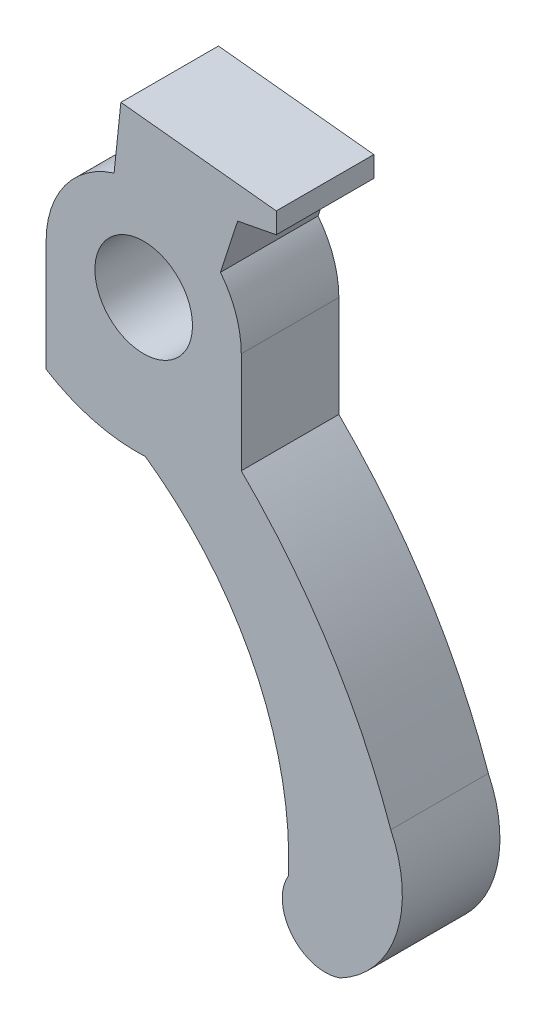
ISO-10303-21;
HEADER;
FILE_DESCRIPTION(('STEP AP214'),'2;1');
FILE_NAME('part.step','',(''),(''),'','','');
FILE_SCHEMA(('AUTOMOTIVE_DESIGN { 1 0 10303 214 1 1 1 1 }'));
ENDSEC;
DATA;
#1=APPLICATION_CONTEXT('core data for automotive mechanical design processes');
#2=APPLICATION_PROTOCOL_DEFINITION('international standard','automotive_design',2000,#1);
#3=PRODUCT_CONTEXT('',#1,'mechanical');
#4=PRODUCT('Part','Part','',(#3));
#5=PRODUCT_RELATED_PRODUCT_CATEGORY('part','',(#4));
#6=PRODUCT_DEFINITION_FORMATION('','',#4);
#7=PRODUCT_DEFINITION_CONTEXT('part definition',#1,'design');
#8=PRODUCT_DEFINITION('design','',#6,#7);
#9=PRODUCT_DEFINITION_SHAPE('','',#8);
#10=(LENGTH_UNIT() NAMED_UNIT(*) SI_UNIT(.MILLI.,.METRE.));
#11=(NAMED_UNIT(*) PLANE_ANGLE_UNIT() SI_UNIT($,.RADIAN.));
#12=(NAMED_UNIT(*) SI_UNIT($,.STERADIAN.) SOLID_ANGLE_UNIT());
#13=UNCERTAINTY_MEASURE_WITH_UNIT(LENGTH_MEASURE(1.E-05),#10,'distance_accuracy_value','');
#14=(GEOMETRIC_REPRESENTATION_CONTEXT(3) GLOBAL_UNCERTAINTY_ASSIGNED_CONTEXT((#13)) GLOBAL_UNIT_ASSIGNED_CONTEXT((#10,
#11,#12)) REPRESENTATION_CONTEXT('',''));
#15=CARTESIAN_POINT('',(0.,0.,0.));
#16=DIRECTION('',(0.,0.,1.));
#17=DIRECTION('',(1.,0.,0.));
#18=AXIS2_PLACEMENT_3D('',#15,#16,#17);
#19=CARTESIAN_POINT('',(-0.422481062071549,2.02076444821993,3.));
#20=DIRECTION('',(0.,0.,-1.));
#21=DIRECTION('',(-1.,0.,0.));
#22=AXIS2_PLACEMENT_3D('',#19,#20,#21);
#23=CYLINDRICAL_SURFACE('',#22,10.4545756931174);
#24=DIRECTION('',(0.,0.,-1.));
#25=VECTOR('',#24,1.);
#26=CARTESIAN_POINT('',(0.103407110007305,-8.42057620102569,3.));
#27=LINE('',#26,#25);
#28=CARTESIAN_POINT('',(0.103407110007305,-8.42057620102569,3.));
#29=VERTEX_POINT('',#28);
#30=CARTESIAN_POINT('',(0.103407110007305,-8.42057620102569,-3.));
#31=VERTEX_POINT('',#30);
#32=EDGE_CURVE('E50',#29,#31,#27,.T.);
#33=ORIENTED_EDGE('',*,*,#32,.F.);
#34=CARTESIAN_POINT('',(-0.422481062071549,2.02076444821993,3.));
#35=DIRECTION('',(0.,0.,1.));
#36=DIRECTION('',(1.,0.,0.));
#37=AXIS2_PLACEMENT_3D('',#34,#35,#36);
#38=CIRCLE('',#37,10.4545756931174);
#39=CARTESIAN_POINT('',(-6.,-6.82171458314739,3.));
#40=VERTEX_POINT('',#39);
#41=EDGE_CURVE('E153',#40,#29,#38,.T.);
#42=ORIENTED_EDGE('',*,*,#41,.F.);
#43=DIRECTION('',(0.,0.,-1.));
#44=VECTOR('',#43,1.);
#45=CARTESIAN_POINT('',(-6.,-6.82171458314739,3.));
#46=LINE('',#45,#44);
#47=CARTESIAN_POINT('',(-6.,-6.82171458314739,-3.));
#48=VERTEX_POINT('',#47);
#49=EDGE_CURVE('E231',#40,#48,#46,.T.);
#50=ORIENTED_EDGE('',*,*,#49,.T.);
#51=CARTESIAN_POINT('',(-0.422481062071549,2.02076444821993,-3.));
#52=DIRECTION('',(0.,0.,1.));
#53=DIRECTION('',(1.,0.,0.));
#54=AXIS2_PLACEMENT_3D('',#51,#52,#53);
#55=CIRCLE('',#54,10.4545756931174);
#56=EDGE_CURVE('E55',#48,#31,#55,.T.);
#57=ORIENTED_EDGE('',*,*,#56,.T.);
#58=EDGE_LOOP('',(#33,#42,#50,#57));
#59=FACE_BOUND('',#58,.T.);
#60=ADVANCED_FACE('F35',(#59),#23,.T.);
#61=CARTESIAN_POINT('',(-2.39345302679688,0.250790946089448,3.));
#62=DIRECTION('',(0.994555154195894,-0.104211540927012,0.));
#63=DIRECTION('',(0.104211540927012,0.994555154195894,0.));
#64=AXIS2_PLACEMENT_3D('',#61,#62,#63);
#65=PLANE('',#64);
#66=DIRECTION('',(-0.104211540927012,-0.994555154195894,0.));
#67=VECTOR('',#66,1.);
#68=CARTESIAN_POINT('',(-2.39345302679688,0.250790946089448,-3.));
#69=LINE('',#68,#67);
#70=CARTESIAN_POINT('',(-1.40435497679137,9.69036505551617,-3.));
#71=VERTEX_POINT('',#70);
#72=CARTESIAN_POINT('',(-1.82068297624839,5.71708960048724,-3.));
#73=VERTEX_POINT('',#72);
#74=EDGE_CURVE('E163',#71,#73,#69,.T.);
#75=ORIENTED_EDGE('',*,*,#74,.T.);
#76=DIRECTION('',(0.,0.,-1.));
#77=VECTOR('',#76,1.);
#78=CARTESIAN_POINT('',(-1.82068297624839,5.71708960048724,3.));
#79=LINE('',#78,#77);
#80=CARTESIAN_POINT('',(-1.82068297624839,5.71708960048724,3.));
#81=VERTEX_POINT('',#80);
#82=EDGE_CURVE('E11',#81,#73,#79,.T.);
#83=ORIENTED_EDGE('',*,*,#82,.F.);
#84=DIRECTION('',(-0.104211540927012,-0.994555154195894,0.));
#85=VECTOR('',#84,1.);
#86=CARTESIAN_POINT('',(-2.39345302679688,0.250790946089448,3.));
#87=LINE('',#86,#85);
#88=CARTESIAN_POINT('',(-1.40435497679137,9.69036505551617,3.));
#89=VERTEX_POINT('',#88);
#90=EDGE_CURVE('E172',#89,#81,#87,.T.);
#91=ORIENTED_EDGE('',*,*,#90,.F.);
#92=DIRECTION('',(0.,0.,-1.));
#93=VECTOR('',#92,1.);
#94=CARTESIAN_POINT('',(-1.40435497679137,9.69036505551617,3.));
#95=LINE('',#94,#93);
#96=EDGE_CURVE('E191',#89,#71,#95,.T.);
#97=ORIENTED_EDGE('',*,*,#96,.T.);
#98=EDGE_LOOP('',(#75,#83,#91,#97));
#99=FACE_BOUND('',#98,.T.);
#100=ADVANCED_FACE('F295',(#99),#65,.F.);
#101=CARTESIAN_POINT('',(0.,0.,3.));
#102=DIRECTION('',(0.,0.,-1.));
#103=DIRECTION('',(-1.,0.,0.));
#104=AXIS2_PLACEMENT_3D('',#101,#102,#103);
#105=CYLINDRICAL_SURFACE('',#104,6.);
#106=CARTESIAN_POINT('',(0.,0.,-3.));
#107=DIRECTION('',(0.,0.,1.));
#108=DIRECTION('',(1.,0.,0.));
#109=AXIS2_PLACEMENT_3D('',#106,#107,#108);
#110=CIRCLE('',#109,6.);
#111=CARTESIAN_POINT('',(-6.,0.,-3.));
#112=VERTEX_POINT('',#111);
#113=EDGE_CURVE('E195',#73,#112,#110,.T.);
#114=ORIENTED_EDGE('',*,*,#113,.T.);
#115=DIRECTION('',(0.,0.,-1.));
#116=VECTOR('',#115,1.);
#117=CARTESIAN_POINT('',(-6.,0.,3.));
#118=LINE('',#117,#116);
#119=CARTESIAN_POINT('',(-6.,0.,3.));
#120=VERTEX_POINT('',#119);
#121=EDGE_CURVE('E43',#120,#112,#118,.T.);
#122=ORIENTED_EDGE('',*,*,#121,.F.);
#123=CARTESIAN_POINT('',(0.,0.,3.));
#124=DIRECTION('',(0.,0.,1.));
#125=DIRECTION('',(1.,0.,0.));
#126=AXIS2_PLACEMENT_3D('',#123,#124,#125);
#127=CIRCLE('',#126,6.);
#128=EDGE_CURVE('E175',#81,#120,#127,.T.);
#129=ORIENTED_EDGE('',*,*,#128,.F.);
#130=ORIENTED_EDGE('',*,*,#82,.T.);
#131=EDGE_LOOP('',(#114,#122,#129,#130));
#132=FACE_BOUND('',#131,.T.);
#133=ADVANCED_FACE('F296',(#132),#105,.T.);
#134=CARTESIAN_POINT('',(-6.,0.,3.));
#135=DIRECTION('',(1.,0.,0.));
#136=DIRECTION('',(0.,0.,-1.));
#137=AXIS2_PLACEMENT_3D('',#134,#135,#136);
#138=PLANE('',#137);
#139=DIRECTION('',(0.,-1.,0.));
#140=VECTOR('',#139,1.);
#141=CARTESIAN_POINT('',(-6.,0.,-3.));
#142=LINE('',#141,#140);
#143=EDGE_CURVE('E197',#112,#48,#142,.T.);
#144=ORIENTED_EDGE('',*,*,#143,.T.);
#145=ORIENTED_EDGE('',*,*,#49,.F.);
#146=DIRECTION('',(0.,-1.,0.));
#147=VECTOR('',#146,1.);
#148=CARTESIAN_POINT('',(-6.,0.,3.));
#149=LINE('',#148,#147);
#150=EDGE_CURVE('E177',#120,#40,#149,.T.);
#151=ORIENTED_EDGE('',*,*,#150,.F.);
#152=ORIENTED_EDGE('',*,*,#121,.T.);
#153=EDGE_LOOP('',(#144,#145,#151,#152));
#154=FACE_BOUND('',#153,.T.);
#155=ADVANCED_FACE('F237',(#154),#138,.F.);
#156=CARTESIAN_POINT('',(6.,0.,3.));
#157=DIRECTION('',(-1.,0.,0.));
#158=DIRECTION('',(0.,0.,1.));
#159=AXIS2_PLACEMENT_3D('',#156,#157,#158);
#160=PLANE('',#159);
#161=DIRECTION('',(0.,1.,0.));
#162=VECTOR('',#161,1.);
#163=CARTESIAN_POINT('',(6.,0.,-3.));
#164=LINE('',#163,#162);
#165=CARTESIAN_POINT('',(6.,-6.22847126973926,-3.));
#166=VERTEX_POINT('',#165);
#167=CARTESIAN_POINT('',(6.,0.,-3.));
#168=VERTEX_POINT('',#167);
#169=EDGE_CURVE('E200',#166,#168,#164,.T.);
#170=ORIENTED_EDGE('',*,*,#169,.T.);
#171=DIRECTION('',(0.,0.,-1.));
#172=VECTOR('',#171,1.);
#173=CARTESIAN_POINT('',(6.,0.,3.));
#174=LINE('',#173,#172);
#175=CARTESIAN_POINT('',(6.,0.,3.));
#176=VERTEX_POINT('',#175);
#177=EDGE_CURVE('E225',#176,#168,#174,.T.);
#178=ORIENTED_EDGE('',*,*,#177,.F.);
#179=DIRECTION('',(0.,1.,0.));
#180=VECTOR('',#179,1.);
#181=CARTESIAN_POINT('',(6.,0.,3.));
#182=LINE('',#181,#180);
#183=CARTESIAN_POINT('',(6.,-6.22847126973926,3.));
#184=VERTEX_POINT('',#183);
#185=EDGE_CURVE('E180',#184,#176,#182,.T.);
#186=ORIENTED_EDGE('',*,*,#185,.F.);
#187=DIRECTION('',(0.,0.,-1.));
#188=VECTOR('',#187,1.);
#189=CARTESIAN_POINT('',(6.,-6.22847126973926,3.));
#190=LINE('',#189,#188);
#191=EDGE_CURVE('E228',#184,#166,#190,.T.);
#192=ORIENTED_EDGE('',*,*,#191,.T.);
#193=EDGE_LOOP('',(#170,#178,#186,#192));
#194=FACE_BOUND('',#193,.T.);
#195=ADVANCED_FACE('F267',(#194),#160,.F.);
#196=CARTESIAN_POINT('',(0.,0.,3.));
#197=DIRECTION('',(0.,0.,-1.));
#198=DIRECTION('',(-1.,0.,0.));
#199=AXIS2_PLACEMENT_3D('',#196,#197,#198);
#200=CYLINDRICAL_SURFACE('',#199,6.);
#201=CARTESIAN_POINT('',(0.,0.,-3.));
#202=DIRECTION('',(0.,0.,1.));
#203=DIRECTION('',(1.,0.,0.));
#204=AXIS2_PLACEMENT_3D('',#201,#202,#203);
#205=CIRCLE('',#204,6.);
#206=CARTESIAN_POINT('',(4.72145116796742,3.70241797593128,-3.));
#207=VERTEX_POINT('',#206);
#208=EDGE_CURVE('E202',#168,#207,#205,.T.);
#209=ORIENTED_EDGE('',*,*,#208,.T.);
#210=DIRECTION('',(0.,0.,-1.));
#211=VECTOR('',#210,1.);
#212=CARTESIAN_POINT('',(4.72145116796742,3.70241797593128,3.));
#213=LINE('',#212,#211);
#214=CARTESIAN_POINT('',(4.72145116796742,3.70241797593128,3.));
#215=VERTEX_POINT('',#214);
#216=EDGE_CURVE('E222',#215,#207,#213,.T.);
#217=ORIENTED_EDGE('',*,*,#216,.F.);
#218=CARTESIAN_POINT('',(0.,0.,3.));
#219=DIRECTION('',(0.,0.,1.));
#220=DIRECTION('',(1.,0.,0.));
#221=AXIS2_PLACEMENT_3D('',#218,#219,#220);
#222=CIRCLE('',#221,6.);
#223=EDGE_CURVE('E182',#176,#215,#222,.T.);
#224=ORIENTED_EDGE('',*,*,#223,.F.);
#225=ORIENTED_EDGE('',*,*,#177,.T.);
#226=EDGE_LOOP('',(#209,#217,#224,#225));
#227=FACE_BOUND('',#226,.T.);
#228=ADVANCED_FACE('F271',(#227),#200,.T.);
#229=CARTESIAN_POINT('',(3.18606405177074,-1.03302685772919,3.));
#230=DIRECTION('',(-0.951248330625304,0.308426025948804,0.));
#231=DIRECTION('',(-0.308426025948804,-0.951248330625304,0.));
#232=AXIS2_PLACEMENT_3D('',#229,#230,#231);
#233=PLANE('',#232);
#234=DIRECTION('',(0.308426025948804,0.951248330625304,0.));
#235=VECTOR('',#234,1.);
#236=CARTESIAN_POINT('',(3.18606405177074,-1.03302685772919,-3.));
#237=LINE('',#236,#235);
#238=CARTESIAN_POINT('',(5.77713676312735,6.95836616309157,-3.));
#239=VERTEX_POINT('',#238);
#240=EDGE_CURVE('E204',#207,#239,#237,.T.);
#241=ORIENTED_EDGE('',*,*,#240,.T.);
#242=DIRECTION('',(0.,0.,-1.));
#243=VECTOR('',#242,1.);
#244=CARTESIAN_POINT('',(5.77713676312735,6.95836616309157,3.));
#245=LINE('',#244,#243);
#246=CARTESIAN_POINT('',(5.77713676312735,6.95836616309157,3.));
#247=VERTEX_POINT('',#246);
#248=EDGE_CURVE('E219',#247,#239,#245,.T.);
#249=ORIENTED_EDGE('',*,*,#248,.F.);
#250=DIRECTION('',(0.308426025948804,0.951248330625304,0.));
#251=VECTOR('',#250,1.);
#252=CARTESIAN_POINT('',(3.18606405177074,-1.03302685772919,3.));
#253=LINE('',#252,#251);
#254=EDGE_CURVE('E184',#215,#247,#253,.T.);
#255=ORIENTED_EDGE('',*,*,#254,.F.);
#256=ORIENTED_EDGE('',*,*,#216,.T.);
#257=EDGE_LOOP('',(#241,#249,#255,#256));
#258=FACE_BOUND('',#257,.T.);
#259=ADVANCED_FACE('F277',(#258),#233,.F.);
#260=CARTESIAN_POINT('',(-1.08635222990454,5.63523232551239,3.));
#261=DIRECTION('',(-0.189293282925878,0.98192059406,0.));
#262=DIRECTION('',(-0.98192059406,-0.189293282925878,0.));
#263=AXIS2_PLACEMENT_3D('',#260,#261,#262);
#264=PLANE('',#263);
#265=DIRECTION('',(0.98192059406,0.189293282925878,0.));
#266=VECTOR('',#265,1.);
#267=CARTESIAN_POINT('',(-1.08635222990454,5.63523232551239,-3.));
#268=LINE('',#267,#266);
#269=CARTESIAN_POINT('',(8.15228511204424,7.41624394987214,-3.));
#270=VERTEX_POINT('',#269);
#271=EDGE_CURVE('E206',#239,#270,#268,.T.);
#272=ORIENTED_EDGE('',*,*,#271,.T.);
#273=DIRECTION('',(0.,0.,-1.));
#274=VECTOR('',#273,1.);
#275=CARTESIAN_POINT('',(8.15228511204424,7.41624394987214,3.));
#276=LINE('',#275,#274);
#277=CARTESIAN_POINT('',(8.15228511204424,7.41624394987214,3.));
#278=VERTEX_POINT('',#277);
#279=EDGE_CURVE('E216',#278,#270,#276,.T.);
#280=ORIENTED_EDGE('',*,*,#279,.F.);
#281=DIRECTION('',(0.98192059406,0.189293282925878,0.));
#282=VECTOR('',#281,1.);
#283=CARTESIAN_POINT('',(-1.08635222990454,5.63523232551239,3.));
#284=LINE('',#283,#282);
#285=EDGE_CURVE('E186',#247,#278,#284,.T.);
#286=ORIENTED_EDGE('',*,*,#285,.F.);
#287=ORIENTED_EDGE('',*,*,#248,.T.);
#288=EDGE_LOOP('',(#272,#280,#286,#287));
#289=FACE_BOUND('',#288,.T.);
#290=ADVANCED_FACE('F281',(#289),#264,.F.);
#291=CARTESIAN_POINT('',(8.15228511204424,0.,3.));
#292=DIRECTION('',(-1.,0.,0.));
#293=DIRECTION('',(0.,0.,1.));
#294=AXIS2_PLACEMENT_3D('',#291,#292,#293);
#295=PLANE('',#294);
#296=DIRECTION('',(0.,1.,0.));
#297=VECTOR('',#296,1.);
#298=CARTESIAN_POINT('',(8.15228511204424,0.,-3.));
#299=LINE('',#298,#297);
#300=CARTESIAN_POINT('',(8.15228511204424,8.68900059066895,-3.));
#301=VERTEX_POINT('',#300);
#302=EDGE_CURVE('E208',#270,#301,#299,.T.);
#303=ORIENTED_EDGE('',*,*,#302,.T.);
#304=DIRECTION('',(0.,0.,-1.));
#305=VECTOR('',#304,1.);
#306=CARTESIAN_POINT('',(8.15228511204424,8.68900059066895,3.));
#307=LINE('',#306,#305);
#308=CARTESIAN_POINT('',(8.15228511204424,8.68900059066895,3.));
#309=VERTEX_POINT('',#308);
#310=EDGE_CURVE('E213',#309,#301,#307,.T.);
#311=ORIENTED_EDGE('',*,*,#310,.F.);
#312=DIRECTION('',(0.,1.,0.));
#313=VECTOR('',#312,1.);
#314=CARTESIAN_POINT('',(8.15228511204424,0.,3.));
#315=LINE('',#314,#313);
#316=EDGE_CURVE('E188',#278,#309,#315,.T.);
#317=ORIENTED_EDGE('',*,*,#316,.F.);
#318=ORIENTED_EDGE('',*,*,#279,.T.);
#319=EDGE_LOOP('',(#303,#311,#317,#318));
#320=FACE_BOUND('',#319,.T.);
#321=ADVANCED_FACE('F286',(#320),#295,.F.);
#322=CARTESIAN_POINT('',(0.,0.,3.));
#323=DIRECTION('',(0.,0.,-1.));
#324=DIRECTION('',(-1.,0.,0.));
#325=AXIS2_PLACEMENT_3D('',#322,#323,#324);
#326=CYLINDRICAL_SURFACE('',#325,3.);
#327=CARTESIAN_POINT('',(0.,0.,3.));
#328=DIRECTION('',(0.,0.,1.));
#329=DIRECTION('',(1.,0.,0.));
#330=AXIS2_PLACEMENT_3D('',#327,#328,#329);
#331=CIRCLE('',#330,3.);
#332=CARTESIAN_POINT('',(3.,0.,3.));
#333=VERTEX_POINT('',#332);
#334=EDGE_CURVE('E169',#333,#333,#331,.T.);
#335=ORIENTED_EDGE('',*,*,#334,.T.);
#336=EDGE_LOOP('',(#335));
#337=FACE_BOUND('',#336,.T.);
#338=CARTESIAN_POINT('',(0.,0.,-3.));
#339=DIRECTION('',(0.,0.,1.));
#340=DIRECTION('',(1.,0.,0.));
#341=AXIS2_PLACEMENT_3D('',#338,#339,#340);
#342=CIRCLE('',#341,3.);
#343=CARTESIAN_POINT('',(3.,0.,-3.));
#344=VERTEX_POINT('',#343);
#345=EDGE_CURVE('E160',#344,#344,#342,.T.);
#346=ORIENTED_EDGE('',*,*,#345,.F.);
#347=EDGE_LOOP('',(#346));
#348=FACE_BOUND('',#347,.T.);
#349=ADVANCED_FACE('F37',(#337,#348),#326,.F.);
#350=CARTESIAN_POINT('',(0.989098050005509,9.43957410942673,3.));
#351=DIRECTION('',(-0.104211540927012,-0.994555154195894,0.));
#352=DIRECTION('',(0.994555154195894,-0.104211540927012,0.));
#353=AXIS2_PLACEMENT_3D('',#350,#351,#352);
#354=PLANE('',#353);
#355=DIRECTION('',(-0.994555154195894,0.104211540927012,0.));
#356=VECTOR('',#355,1.);
#357=CARTESIAN_POINT('',(0.989098050005509,9.43957410942673,-3.));
#358=LINE('',#357,#356);
#359=EDGE_CURVE('E173',#301,#71,#358,.T.);
#360=ORIENTED_EDGE('',*,*,#359,.T.);
#361=ORIENTED_EDGE('',*,*,#96,.F.);
#362=DIRECTION('',(-0.994555154195894,0.104211540927012,0.));
#363=VECTOR('',#362,1.);
#364=CARTESIAN_POINT('',(0.989098050005509,9.43957410942673,3.));
#365=LINE('',#364,#363);
#366=EDGE_CURVE('E190',#309,#89,#365,.T.);
#367=ORIENTED_EDGE('',*,*,#366,.F.);
#368=ORIENTED_EDGE('',*,*,#310,.T.);
#369=EDGE_LOOP('',(#360,#361,#367,#368));
#370=FACE_BOUND('',#369,.T.);
#371=ADVANCED_FACE('F292',(#370),#354,.F.);
#372=CARTESIAN_POINT('',(0.,0.,3.));
#373=DIRECTION('',(0.,0.,1.));
#374=DIRECTION('',(1.,0.,0.));
#375=AXIS2_PLACEMENT_3D('',#372,#373,#374);
#376=PLANE('',#375);
#377=ORIENTED_EDGE('',*,*,#334,.F.);
#378=EDGE_LOOP('',(#377));
#379=FACE_BOUND('',#378,.T.);
#380=ORIENTED_EDGE('',*,*,#90,.T.);
#381=ORIENTED_EDGE('',*,*,#128,.T.);
#382=ORIENTED_EDGE('',*,*,#150,.T.);
#383=ORIENTED_EDGE('',*,*,#41,.T.);
#384=CARTESIAN_POINT('',(-11.8730554109317,-25.4132006753819,3.));
#385=DIRECTION('',(0.,0.,1.));
#386=DIRECTION('',(1.,0.,0.));
#387=AXIS2_PLACEMENT_3D('',#384,#385,#386);
#388=CIRCLE('',#387,20.7890582047852);
#389=CARTESIAN_POINT('',(8.89424899636918,-26.3639943945705,3.));
#390=VERTEX_POINT('',#389);
#391=EDGE_CURVE('E148',#29,#390,#388,.F.);
#392=ORIENTED_EDGE('',*,*,#391,.T.);
#393=CARTESIAN_POINT('',(11.1618708989459,-27.7200996273325,3.));
#394=DIRECTION('',(0.,0.,1.));
#395=DIRECTION('',(1.,0.,0.));
#396=AXIS2_PLACEMENT_3D('',#393,#394,#395);
#397=CIRCLE('',#396,2.64218290346641);
#398=CARTESIAN_POINT('',(12.0919340837568,-30.193177258065,3.));
#399=VERTEX_POINT('',#398);
#400=EDGE_CURVE('E136',#390,#399,#397,.T.);
#401=ORIENTED_EDGE('',*,*,#400,.T.);
#402=CARTESIAN_POINT('',(8.74217337611042,-23.8621431676548,3.));
#403=DIRECTION('',(0.,0.,1.));
#404=DIRECTION('',(1.,0.,0.));
#405=AXIS2_PLACEMENT_3D('',#402,#403,#404);
#406=CIRCLE('',#405,7.16260353868811);
#407=CARTESIAN_POINT('',(15.1923882263439,-20.7480433236783,3.));
#408=VERTEX_POINT('',#407);
#409=EDGE_CURVE('E147',#408,#399,#406,.F.);
#410=ORIENTED_EDGE('',*,*,#409,.F.);
#411=CARTESIAN_POINT('',(-20.6610645417638,-33.2773292734871,3.));
#412=DIRECTION('',(0.,0.,1.));
#413=DIRECTION('',(1.,0.,0.));
#414=AXIS2_PLACEMENT_3D('',#411,#412,#413);
#415=CIRCLE('',#414,37.9796403591057);
#416=EDGE_CURVE('E249',#408,#184,#415,.T.);
#417=ORIENTED_EDGE('',*,*,#416,.T.);
#418=ORIENTED_EDGE('',*,*,#185,.T.);
#419=ORIENTED_EDGE('',*,*,#223,.T.);
#420=ORIENTED_EDGE('',*,*,#254,.T.);
#421=ORIENTED_EDGE('',*,*,#285,.T.);
#422=ORIENTED_EDGE('',*,*,#316,.T.);
#423=ORIENTED_EDGE('',*,*,#366,.T.);
#424=EDGE_LOOP('',(#380,#381,#382,#383,#392,#401,#410,#417,#418,#419,#420,#421,#422,#423));
#425=FACE_BOUND('',#424,.T.);
#426=ADVANCED_FACE('F152',(#379,#425),#376,.T.);
#427=CARTESIAN_POINT('',(0.,0.,-3.));
#428=DIRECTION('',(0.,0.,1.));
#429=DIRECTION('',(1.,0.,0.));
#430=AXIS2_PLACEMENT_3D('',#427,#428,#429);
#431=PLANE('',#430);
#432=ORIENTED_EDGE('',*,*,#345,.T.);
#433=EDGE_LOOP('',(#432));
#434=FACE_BOUND('',#433,.T.);
#435=ORIENTED_EDGE('',*,*,#74,.F.);
#436=ORIENTED_EDGE('',*,*,#359,.F.);
#437=ORIENTED_EDGE('',*,*,#302,.F.);
#438=ORIENTED_EDGE('',*,*,#271,.F.);
#439=ORIENTED_EDGE('',*,*,#240,.F.);
#440=ORIENTED_EDGE('',*,*,#208,.F.);
#441=ORIENTED_EDGE('',*,*,#169,.F.);
#442=CARTESIAN_POINT('',(-20.6610645417638,-33.2773292734871,-3.));
#443=DIRECTION('',(0.,0.,1.));
#444=DIRECTION('',(1.,0.,0.));
#445=AXIS2_PLACEMENT_3D('',#442,#443,#444);
#446=CIRCLE('',#445,37.9796403591057);
#447=CARTESIAN_POINT('',(15.1923882263439,-20.7480433236783,-3.));
#448=VERTEX_POINT('',#447);
#449=EDGE_CURVE('E155',#448,#166,#446,.T.);
#450=ORIENTED_EDGE('',*,*,#449,.F.);
#451=CARTESIAN_POINT('',(8.74217337611042,-23.8621431676548,-3.));
#452=DIRECTION('',(0.,0.,1.));
#453=DIRECTION('',(1.,0.,0.));
#454=AXIS2_PLACEMENT_3D('',#451,#452,#453);
#455=CIRCLE('',#454,7.16260353868811);
#456=CARTESIAN_POINT('',(12.0919340837568,-30.193177258065,-3.));
#457=VERTEX_POINT('',#456);
#458=EDGE_CURVE('E246',#448,#457,#455,.F.);
#459=ORIENTED_EDGE('',*,*,#458,.T.);
#460=CARTESIAN_POINT('',(11.1618708989459,-27.7200996273325,-3.));
#461=DIRECTION('',(0.,0.,1.));
#462=DIRECTION('',(1.,0.,0.));
#463=AXIS2_PLACEMENT_3D('',#460,#461,#462);
#464=CIRCLE('',#463,2.64218290346641);
#465=CARTESIAN_POINT('',(8.89424899636918,-26.3639943945705,-3.));
#466=VERTEX_POINT('',#465);
#467=EDGE_CURVE('E244',#466,#457,#464,.T.);
#468=ORIENTED_EDGE('',*,*,#467,.F.);
#469=CARTESIAN_POINT('',(-11.8730554109317,-25.4132006753819,-3.));
#470=DIRECTION('',(0.,0.,1.));
#471=DIRECTION('',(1.,0.,0.));
#472=AXIS2_PLACEMENT_3D('',#469,#470,#471);
#473=CIRCLE('',#472,20.7890582047852);
#474=EDGE_CURVE('E159',#31,#466,#473,.F.);
#475=ORIENTED_EDGE('',*,*,#474,.F.);
#476=ORIENTED_EDGE('',*,*,#56,.F.);
#477=ORIENTED_EDGE('',*,*,#143,.F.);
#478=ORIENTED_EDGE('',*,*,#113,.F.);
#479=EDGE_LOOP('',(#435,#436,#437,#438,#439,#440,#441,#450,#459,#468,#475,#476,#477,#478));
#480=FACE_BOUND('',#479,.T.);
#481=ADVANCED_FACE('F242',(#434,#480),#431,.F.);
#482=CARTESIAN_POINT('',(-11.8730554109317,-25.4132006753819,3.));
#483=DIRECTION('',(0.,0.,-1.));
#484=DIRECTION('',(-1.,0.,0.));
#485=AXIS2_PLACEMENT_3D('',#482,#483,#484);
#486=CYLINDRICAL_SURFACE('',#485,20.7890582047852);
#487=ORIENTED_EDGE('',*,*,#474,.T.);
#488=DIRECTION('',(0.,0.,-1.));
#489=VECTOR('',#488,1.);
#490=CARTESIAN_POINT('',(8.89424899636918,-26.3639943945705,3.));
#491=LINE('',#490,#489);
#492=EDGE_CURVE('E141',#390,#466,#491,.T.);
#493=ORIENTED_EDGE('',*,*,#492,.F.);
#494=ORIENTED_EDGE('',*,*,#391,.F.);
#495=ORIENTED_EDGE('',*,*,#32,.T.);
#496=EDGE_LOOP('',(#487,#493,#494,#495));
#497=FACE_BOUND('',#496,.T.);
#498=ADVANCED_FACE('F157',(#497),#486,.F.);
#499=CARTESIAN_POINT('',(11.1618708989459,-27.7200996273325,3.));
#500=DIRECTION('',(0.,0.,-1.));
#501=DIRECTION('',(-1.,0.,0.));
#502=AXIS2_PLACEMENT_3D('',#499,#500,#501);
#503=CYLINDRICAL_SURFACE('',#502,2.64218290346641);
#504=ORIENTED_EDGE('',*,*,#467,.T.);
#505=DIRECTION('',(0.,0.,-1.));
#506=VECTOR('',#505,1.);
#507=CARTESIAN_POINT('',(12.0919340837568,-30.193177258065,3.));
#508=LINE('',#507,#506);
#509=EDGE_CURVE('E143',#399,#457,#508,.T.);
#510=ORIENTED_EDGE('',*,*,#509,.F.);
#511=ORIENTED_EDGE('',*,*,#400,.F.);
#512=ORIENTED_EDGE('',*,*,#492,.T.);
#513=EDGE_LOOP('',(#504,#510,#511,#512));
#514=FACE_BOUND('',#513,.T.);
#515=ADVANCED_FACE('F139',(#514),#503,.T.);
#516=CARTESIAN_POINT('',(8.74217337611042,-23.8621431676548,3.));
#517=DIRECTION('',(0.,0.,-1.));
#518=DIRECTION('',(-1.,0.,0.));
#519=AXIS2_PLACEMENT_3D('',#516,#517,#518);
#520=CYLINDRICAL_SURFACE('',#519,7.16260353868811);
#521=ORIENTED_EDGE('',*,*,#458,.F.);
#522=DIRECTION('',(0.,0.,-1.));
#523=VECTOR('',#522,1.);
#524=CARTESIAN_POINT('',(15.1923882263439,-20.7480433236783,3.));
#525=LINE('',#524,#523);
#526=EDGE_CURVE('E165',#408,#448,#525,.T.);
#527=ORIENTED_EDGE('',*,*,#526,.F.);
#528=ORIENTED_EDGE('',*,*,#409,.T.);
#529=ORIENTED_EDGE('',*,*,#509,.T.);
#530=EDGE_LOOP('',(#521,#527,#528,#529));
#531=FACE_BOUND('',#530,.T.);
#532=ADVANCED_FACE('F264',(#531),#520,.T.);
#533=CARTESIAN_POINT('',(-20.6610645417638,-33.2773292734871,3.));
#534=DIRECTION('',(0.,0.,-1.));
#535=DIRECTION('',(-1.,0.,0.));
#536=AXIS2_PLACEMENT_3D('',#533,#534,#535);
#537=CYLINDRICAL_SURFACE('',#536,37.9796403591057);
#538=ORIENTED_EDGE('',*,*,#449,.T.);
#539=ORIENTED_EDGE('',*,*,#191,.F.);
#540=ORIENTED_EDGE('',*,*,#416,.F.);
#541=ORIENTED_EDGE('',*,*,#526,.T.);
#542=EDGE_LOOP('',(#538,#539,#540,#541));
#543=FACE_BOUND('',#542,.T.);
#544=ADVANCED_FACE('F258',(#543),#537,.T.);
#545=CLOSED_SHELL('',(#60,#100,#133,#155,#195,#228,#259,#290,#321,#349,#371,#426,#481,#498,#515,
#532,#544));
#546=MANIFOLD_SOLID_BREP('B2',#545);
#547=ADVANCED_BREP_SHAPE_REPRESENTATION('',(#18,#546),#14);
#548=SHAPE_DEFINITION_REPRESENTATION(#9,#547);
ENDSEC;
END-ISO-10303-21;
